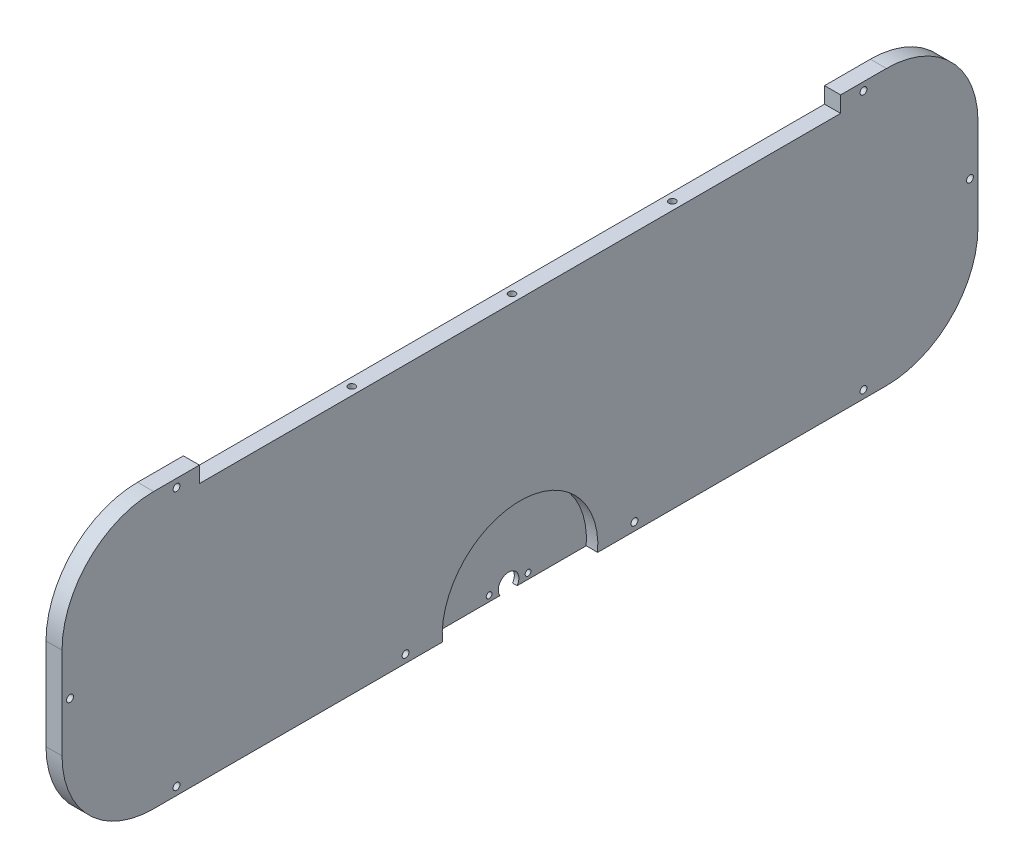
ISO-10303-21;
HEADER;
FILE_DESCRIPTION(('STEP AP214'),'2;1');
FILE_NAME('part.step','',(''),(''),'','','');
FILE_SCHEMA(('AUTOMOTIVE_DESIGN { 1 0 10303 214 1 1 1 1 }'));
ENDSEC;
DATA;
#1=APPLICATION_CONTEXT('core data for automotive mechanical design processes');
#2=APPLICATION_PROTOCOL_DEFINITION('international standard','automotive_design',2000,#1);
#3=PRODUCT_CONTEXT('',#1,'mechanical');
#4=PRODUCT('Part','Part','',(#3));
#5=PRODUCT_RELATED_PRODUCT_CATEGORY('part','',(#4));
#6=PRODUCT_DEFINITION_FORMATION('','',#4);
#7=PRODUCT_DEFINITION_CONTEXT('part definition',#1,'design');
#8=PRODUCT_DEFINITION('design','',#6,#7);
#9=PRODUCT_DEFINITION_SHAPE('','',#8);
#10=(LENGTH_UNIT() NAMED_UNIT(*) SI_UNIT(.MILLI.,.METRE.));
#11=(NAMED_UNIT(*) PLANE_ANGLE_UNIT() SI_UNIT($,.RADIAN.));
#12=(NAMED_UNIT(*) SI_UNIT($,.STERADIAN.) SOLID_ANGLE_UNIT());
#13=UNCERTAINTY_MEASURE_WITH_UNIT(LENGTH_MEASURE(1.E-05),#10,'distance_accuracy_value','');
#14=(GEOMETRIC_REPRESENTATION_CONTEXT(3) GLOBAL_UNCERTAINTY_ASSIGNED_CONTEXT((#13)) GLOBAL_UNIT_ASSIGNED_CONTEXT((#10,
#11,#12)) REPRESENTATION_CONTEXT('',''));
#15=CARTESIAN_POINT('',(0.,0.,0.));
#16=DIRECTION('',(0.,0.,1.));
#17=DIRECTION('',(1.,0.,0.));
#18=AXIS2_PLACEMENT_3D('',#15,#16,#17);
#19=CARTESIAN_POINT('',(-3.,2.49999999999994,-8.5));
#20=DIRECTION('',(1.,0.,0.));
#21=DIRECTION('',(0.,0.,-1.));
#22=AXIS2_PLACEMENT_3D('',#19,#20,#21);
#23=CYLINDRICAL_SURFACE('',#22,1.25);
#24=CARTESIAN_POINT('',(0.,2.49999999999994,-8.5));
#25=DIRECTION('',(-1.,0.,0.));
#26=DIRECTION('',(0.,0.,1.));
#27=AXIS2_PLACEMENT_3D('',#24,#25,#26);
#28=CIRCLE('',#27,1.25);
#29=CARTESIAN_POINT('',(0.,2.49999999999994,-7.25));
#30=VERTEX_POINT('',#29);
#31=EDGE_CURVE('E186',#30,#30,#28,.T.);
#32=ORIENTED_EDGE('',*,*,#31,.T.);
#33=EDGE_LOOP('',(#32));
#34=FACE_BOUND('',#33,.T.);
#35=CARTESIAN_POINT('',(2.,2.49999999999994,-8.5));
#36=DIRECTION('',(1.,0.,0.));
#37=DIRECTION('',(0.,0.,-1.));
#38=AXIS2_PLACEMENT_3D('',#35,#36,#37);
#39=CIRCLE('',#38,1.25);
#40=CARTESIAN_POINT('',(2.,2.49999999999994,-9.75));
#41=VERTEX_POINT('',#40);
#42=EDGE_CURVE('E173',#41,#41,#39,.F.);
#43=ORIENTED_EDGE('',*,*,#42,.F.);
#44=EDGE_LOOP('',(#43));
#45=FACE_BOUND('',#44,.T.);
#46=ADVANCED_FACE('F36',(#34,#45),#23,.F.);
#47=CARTESIAN_POINT('',(-3.,2.49999999999994,8.5));
#48=DIRECTION('',(1.,0.,0.));
#49=DIRECTION('',(0.,0.,-1.));
#50=AXIS2_PLACEMENT_3D('',#47,#48,#49);
#51=CYLINDRICAL_SURFACE('',#50,1.25);
#52=CARTESIAN_POINT('',(0.,2.49999999999994,8.5));
#53=DIRECTION('',(-1.,0.,0.));
#54=DIRECTION('',(0.,0.,1.));
#55=AXIS2_PLACEMENT_3D('',#52,#53,#54);
#56=CIRCLE('',#55,1.25);
#57=CARTESIAN_POINT('',(0.,2.49999999999994,9.75));
#58=VERTEX_POINT('',#57);
#59=EDGE_CURVE('E197',#58,#58,#56,.T.);
#60=ORIENTED_EDGE('',*,*,#59,.T.);
#61=EDGE_LOOP('',(#60));
#62=FACE_BOUND('',#61,.T.);
#63=CARTESIAN_POINT('',(2.,2.49999999999994,8.5));
#64=DIRECTION('',(1.,0.,0.));
#65=DIRECTION('',(0.,0.,-1.));
#66=AXIS2_PLACEMENT_3D('',#63,#64,#65);
#67=CIRCLE('',#66,1.25);
#68=CARTESIAN_POINT('',(2.,2.49999999999994,7.25));
#69=VERTEX_POINT('',#68);
#70=EDGE_CURVE('E170',#69,#69,#67,.F.);
#71=ORIENTED_EDGE('',*,*,#70,.F.);
#72=EDGE_LOOP('',(#71));
#73=FACE_BOUND('',#72,.T.);
#74=ADVANCED_FACE('F347',(#62,#73),#51,.F.);
#75=CARTESIAN_POINT('',(0.,2.49999999999994,0.));
#76=DIRECTION('',(1.,0.,0.));
#77=DIRECTION('',(0.,0.,-1.));
#78=AXIS2_PLACEMENT_3D('',#75,#76,#77);
#79=CYLINDRICAL_SURFACE('',#78,4.5);
#80=CARTESIAN_POINT('',(2.,2.49999999999994,0.));
#81=DIRECTION('',(1.,0.,0.));
#82=DIRECTION('',(0.,0.,-1.));
#83=AXIS2_PLACEMENT_3D('',#80,#81,#82);
#84=CIRCLE('',#83,4.5);
#85=CARTESIAN_POINT('',(2.,0.,3.74165738677395));
#86=VERTEX_POINT('',#85);
#87=CARTESIAN_POINT('',(2.,0.,-3.74165738677396));
#88=VERTEX_POINT('',#87);
#89=EDGE_CURVE('E11',#86,#88,#84,.F.);
#90=ORIENTED_EDGE('',*,*,#89,.F.);
#91=DIRECTION('',(1.,0.,0.));
#92=VECTOR('',#91,1.);
#93=CARTESIAN_POINT('',(0.,0.,3.74165738677395));
#94=LINE('',#93,#92);
#95=CARTESIAN_POINT('',(0.,0.,3.74165738677395));
#96=VERTEX_POINT('',#95);
#97=EDGE_CURVE('E169',#96,#86,#94,.T.);
#98=ORIENTED_EDGE('',*,*,#97,.F.);
#99=CARTESIAN_POINT('',(0.,2.49999999999994,0.));
#100=DIRECTION('',(1.,0.,0.));
#101=DIRECTION('',(0.,0.,-1.));
#102=AXIS2_PLACEMENT_3D('',#99,#100,#101);
#103=CIRCLE('',#102,4.5);
#104=CARTESIAN_POINT('',(0.,0.,-3.74165738677396));
#105=VERTEX_POINT('',#104);
#106=EDGE_CURVE('E158',#105,#96,#103,.T.);
#107=ORIENTED_EDGE('',*,*,#106,.F.);
#108=DIRECTION('',(1.,0.,0.));
#109=VECTOR('',#108,1.);
#110=CARTESIAN_POINT('',(0.,0.,-3.74165738677396));
#111=LINE('',#110,#109);
#112=EDGE_CURVE('E183',#88,#105,#111,.F.);
#113=ORIENTED_EDGE('',*,*,#112,.F.);
#114=EDGE_LOOP('',(#90,#98,#107,#113));
#115=FACE_BOUND('',#114,.T.);
#116=ADVANCED_FACE('F401',(#115),#79,.F.);
#117=CARTESIAN_POINT('',(7.,0.,-160.));
#118=DIRECTION('',(0.,1.,0.));
#119=DIRECTION('',(0.,0.,1.));
#120=AXIS2_PLACEMENT_3D('',#117,#118,#119);
#121=PLANE('',#120);
#122=DIRECTION('',(0.,0.,-1.));
#123=VECTOR('',#122,1.);
#124=CARTESIAN_POINT('',(2.,0.,-160.));
#125=LINE('',#124,#123);
#126=CARTESIAN_POINT('',(2.,0.,33.9079636663719));
#127=VERTEX_POINT('',#126);
#128=EDGE_CURVE('E50',#127,#86,#125,.T.);
#129=ORIENTED_EDGE('',*,*,#128,.F.);
#130=DIRECTION('',(1.,0.,0.));
#131=VECTOR('',#130,1.);
#132=CARTESIAN_POINT('',(2.,0.,33.9079636663719));
#133=LINE('',#132,#131);
#134=CARTESIAN_POINT('',(7.,0.,33.9079636663719));
#135=VERTEX_POINT('',#134);
#136=EDGE_CURVE('E150',#127,#135,#133,.T.);
#137=ORIENTED_EDGE('',*,*,#136,.T.);
#138=DIRECTION('',(0.,0.,-1.));
#139=VECTOR('',#138,1.);
#140=CARTESIAN_POINT('',(7.,0.,-160.));
#141=LINE('',#140,#139);
#142=CARTESIAN_POINT('',(7.,0.,160.));
#143=VERTEX_POINT('',#142);
#144=EDGE_CURVE('E279',#143,#135,#141,.T.);
#145=ORIENTED_EDGE('',*,*,#144,.F.);
#146=DIRECTION('',(-1.,0.,0.));
#147=VECTOR('',#146,1.);
#148=CARTESIAN_POINT('',(7.,0.,160.));
#149=LINE('',#148,#147);
#150=CARTESIAN_POINT('',(0.,0.,160.));
#151=VERTEX_POINT('',#150);
#152=EDGE_CURVE('E44',#143,#151,#149,.T.);
#153=ORIENTED_EDGE('',*,*,#152,.T.);
#154=DIRECTION('',(0.,0.,-1.));
#155=VECTOR('',#154,1.);
#156=CARTESIAN_POINT('',(0.,0.,-160.));
#157=LINE('',#156,#155);
#158=EDGE_CURVE('E299',#151,#96,#157,.T.);
#159=ORIENTED_EDGE('',*,*,#158,.T.);
#160=ORIENTED_EDGE('',*,*,#97,.T.);
#161=EDGE_LOOP('',(#129,#137,#145,#153,#159,#160));
#162=FACE_BOUND('',#161,.T.);
#163=ADVANCED_FACE('F167',(#162),#121,.F.);
#164=CARTESIAN_POINT('',(7.,120.,-160.));
#165=DIRECTION('',(0.,-1.,0.));
#166=DIRECTION('',(0.,0.,-1.));
#167=AXIS2_PLACEMENT_3D('',#164,#165,#166);
#168=PLANE('',#167);
#169=DIRECTION('',(0.,0.,1.));
#170=VECTOR('',#169,1.);
#171=CARTESIAN_POINT('',(0.,120.,-160.));
#172=LINE('',#171,#170);
#173=CARTESIAN_POINT('',(0.,120.,-160.));
#174=VERTEX_POINT('',#173);
#175=CARTESIAN_POINT('',(0.,120.,-140.));
#176=VERTEX_POINT('',#175);
#177=EDGE_CURVE('E308',#174,#176,#172,.T.);
#178=ORIENTED_EDGE('',*,*,#177,.T.);
#179=DIRECTION('',(1.,0.,0.));
#180=VECTOR('',#179,1.);
#181=CARTESIAN_POINT('',(0.,120.,-140.));
#182=LINE('',#181,#180);
#183=CARTESIAN_POINT('',(7.,120.,-140.));
#184=VERTEX_POINT('',#183);
#185=EDGE_CURVE('E231',#176,#184,#182,.T.);
#186=ORIENTED_EDGE('',*,*,#185,.T.);
#187=DIRECTION('',(0.,0.,1.));
#188=VECTOR('',#187,1.);
#189=CARTESIAN_POINT('',(7.,120.,-160.));
#190=LINE('',#189,#188);
#191=CARTESIAN_POINT('',(7.,120.,-160.));
#192=VERTEX_POINT('',#191);
#193=EDGE_CURVE('E288',#192,#184,#190,.T.);
#194=ORIENTED_EDGE('',*,*,#193,.F.);
#195=DIRECTION('',(-1.,0.,0.));
#196=VECTOR('',#195,1.);
#197=CARTESIAN_POINT('',(7.,120.,-160.));
#198=LINE('',#197,#196);
#199=EDGE_CURVE('E322',#192,#174,#198,.T.);
#200=ORIENTED_EDGE('',*,*,#199,.T.);
#201=EDGE_LOOP('',(#178,#186,#194,#200));
#202=FACE_BOUND('',#201,.T.);
#203=ADVANCED_FACE('F421',(#202),#168,.F.);
#204=CARTESIAN_POINT('',(7.,40.,160.));
#205=DIRECTION('',(-1.,0.,0.));
#206=DIRECTION('',(0.,0.,1.));
#207=AXIS2_PLACEMENT_3D('',#204,#205,#206);
#208=CYLINDRICAL_SURFACE('',#207,40.);
#209=CARTESIAN_POINT('',(0.,40.,160.));
#210=DIRECTION('',(1.,0.,0.));
#211=DIRECTION('',(0.,0.,1.));
#212=AXIS2_PLACEMENT_3D('',#209,#210,#211);
#213=CIRCLE('',#212,40.);
#214=CARTESIAN_POINT('',(0.,40.,200.));
#215=VERTEX_POINT('',#214);
#216=EDGE_CURVE('E273',#215,#151,#213,.T.);
#217=ORIENTED_EDGE('',*,*,#216,.T.);
#218=ORIENTED_EDGE('',*,*,#152,.F.);
#219=CARTESIAN_POINT('',(7.,40.,160.));
#220=DIRECTION('',(1.,0.,0.));
#221=DIRECTION('',(0.,0.,1.));
#222=AXIS2_PLACEMENT_3D('',#219,#220,#221);
#223=CIRCLE('',#222,40.);
#224=CARTESIAN_POINT('',(7.,40.,200.));
#225=VERTEX_POINT('',#224);
#226=EDGE_CURVE('E274',#225,#143,#223,.T.);
#227=ORIENTED_EDGE('',*,*,#226,.F.);
#228=DIRECTION('',(-1.,0.,0.));
#229=VECTOR('',#228,1.);
#230=CARTESIAN_POINT('',(7.,40.,200.));
#231=LINE('',#230,#229);
#232=EDGE_CURVE('E295',#225,#215,#231,.T.);
#233=ORIENTED_EDGE('',*,*,#232,.T.);
#234=EDGE_LOOP('',(#217,#218,#227,#233));
#235=FACE_BOUND('',#234,.T.);
#236=ADVANCED_FACE('F38',(#235),#208,.T.);
#237=CARTESIAN_POINT('',(7.,0.,-33.9079636663719));
#238=VERTEX_POINT('',#237);
#239=CARTESIAN_POINT('',(7.,0.,-160.));
#240=VERTEX_POINT('',#239);
#241=EDGE_CURVE('E277',#238,#240,#141,.T.);
#242=ORIENTED_EDGE('',*,*,#241,.F.);
#243=DIRECTION('',(1.,0.,0.));
#244=VECTOR('',#243,1.);
#245=CARTESIAN_POINT('',(2.,0.,-33.9079636663719));
#246=LINE('',#245,#244);
#247=CARTESIAN_POINT('',(2.,0.,-33.9079636663719));
#248=VERTEX_POINT('',#247);
#249=EDGE_CURVE('E159',#238,#248,#246,.F.);
#250=ORIENTED_EDGE('',*,*,#249,.T.);
#251=DIRECTION('',(0.,0.,-1.));
#252=VECTOR('',#251,1.);
#253=CARTESIAN_POINT('',(2.,0.,-160.));
#254=LINE('',#253,#252);
#255=EDGE_CURVE('E164',#88,#248,#254,.T.);
#256=ORIENTED_EDGE('',*,*,#255,.F.);
#257=ORIENTED_EDGE('',*,*,#112,.T.);
#258=CARTESIAN_POINT('',(0.,0.,-160.));
#259=VERTEX_POINT('',#258);
#260=EDGE_CURVE('E298',#105,#259,#157,.T.);
#261=ORIENTED_EDGE('',*,*,#260,.T.);
#262=DIRECTION('',(-1.,0.,0.));
#263=VECTOR('',#262,1.);
#264=CARTESIAN_POINT('',(7.,0.,-160.));
#265=LINE('',#264,#263);
#266=EDGE_CURVE('E331',#240,#259,#265,.T.);
#267=ORIENTED_EDGE('',*,*,#266,.F.);
#268=EDGE_LOOP('',(#242,#250,#256,#257,#261,#267));
#269=FACE_BOUND('',#268,.T.);
#270=ADVANCED_FACE('F403',(#269),#121,.F.);
#271=CARTESIAN_POINT('',(7.,40.,-160.));
#272=DIRECTION('',(-1.,0.,0.));
#273=DIRECTION('',(0.,0.,1.));
#274=AXIS2_PLACEMENT_3D('',#271,#272,#273);
#275=CYLINDRICAL_SURFACE('',#274,40.);
#276=CARTESIAN_POINT('',(0.,40.,-160.));
#277=DIRECTION('',(1.,0.,0.));
#278=DIRECTION('',(0.,0.,-1.));
#279=AXIS2_PLACEMENT_3D('',#276,#277,#278);
#280=CIRCLE('',#279,40.);
#281=CARTESIAN_POINT('',(0.,40.,-200.));
#282=VERTEX_POINT('',#281);
#283=EDGE_CURVE('E301',#259,#282,#280,.T.);
#284=ORIENTED_EDGE('',*,*,#283,.T.);
#285=DIRECTION('',(-1.,0.,0.));
#286=VECTOR('',#285,1.);
#287=CARTESIAN_POINT('',(7.,40.,-200.));
#288=LINE('',#287,#286);
#289=CARTESIAN_POINT('',(7.,40.,-200.));
#290=VERTEX_POINT('',#289);
#291=EDGE_CURVE('E328',#290,#282,#288,.T.);
#292=ORIENTED_EDGE('',*,*,#291,.F.);
#293=CARTESIAN_POINT('',(7.,40.,-160.));
#294=DIRECTION('',(1.,0.,0.));
#295=DIRECTION('',(0.,0.,-1.));
#296=AXIS2_PLACEMENT_3D('',#293,#294,#295);
#297=CIRCLE('',#296,40.);
#298=EDGE_CURVE('E281',#240,#290,#297,.T.);
#299=ORIENTED_EDGE('',*,*,#298,.F.);
#300=ORIENTED_EDGE('',*,*,#266,.T.);
#301=EDGE_LOOP('',(#284,#292,#299,#300));
#302=FACE_BOUND('',#301,.T.);
#303=ADVANCED_FACE('F410',(#302),#275,.T.);
#304=CARTESIAN_POINT('',(7.,40.,-200.));
#305=DIRECTION('',(0.,0.,1.));
#306=DIRECTION('',(1.,0.,0.));
#307=AXIS2_PLACEMENT_3D('',#304,#305,#306);
#308=PLANE('',#307);
#309=DIRECTION('',(0.,1.,0.));
#310=VECTOR('',#309,1.);
#311=CARTESIAN_POINT('',(0.,40.,-200.));
#312=LINE('',#311,#310);
#313=CARTESIAN_POINT('',(0.,80.,-200.));
#314=VERTEX_POINT('',#313);
#315=EDGE_CURVE('E303',#282,#314,#312,.T.);
#316=ORIENTED_EDGE('',*,*,#315,.T.);
#317=DIRECTION('',(-1.,0.,0.));
#318=VECTOR('',#317,1.);
#319=CARTESIAN_POINT('',(7.,80.,-200.));
#320=LINE('',#319,#318);
#321=CARTESIAN_POINT('',(7.,80.,-200.));
#322=VERTEX_POINT('',#321);
#323=EDGE_CURVE('E325',#322,#314,#320,.T.);
#324=ORIENTED_EDGE('',*,*,#323,.F.);
#325=DIRECTION('',(0.,1.,0.));
#326=VECTOR('',#325,1.);
#327=CARTESIAN_POINT('',(7.,40.,-200.));
#328=LINE('',#327,#326);
#329=EDGE_CURVE('E283',#290,#322,#328,.T.);
#330=ORIENTED_EDGE('',*,*,#329,.F.);
#331=ORIENTED_EDGE('',*,*,#291,.T.);
#332=EDGE_LOOP('',(#316,#324,#330,#331));
#333=FACE_BOUND('',#332,.T.);
#334=ADVANCED_FACE('F413',(#333),#308,.F.);
#335=CARTESIAN_POINT('',(7.,80.,-160.));
#336=DIRECTION('',(-1.,0.,0.));
#337=DIRECTION('',(0.,0.,1.));
#338=AXIS2_PLACEMENT_3D('',#335,#336,#337);
#339=CYLINDRICAL_SURFACE('',#338,40.);
#340=CARTESIAN_POINT('',(0.,80.,-160.));
#341=DIRECTION('',(1.,0.,0.));
#342=DIRECTION('',(0.,0.,1.));
#343=AXIS2_PLACEMENT_3D('',#340,#341,#342);
#344=CIRCLE('',#343,40.);
#345=EDGE_CURVE('E305',#314,#174,#344,.T.);
#346=ORIENTED_EDGE('',*,*,#345,.T.);
#347=ORIENTED_EDGE('',*,*,#199,.F.);
#348=CARTESIAN_POINT('',(7.,80.,-160.));
#349=DIRECTION('',(1.,0.,0.));
#350=DIRECTION('',(0.,0.,1.));
#351=AXIS2_PLACEMENT_3D('',#348,#349,#350);
#352=CIRCLE('',#351,40.);
#353=EDGE_CURVE('E285',#322,#192,#352,.T.);
#354=ORIENTED_EDGE('',*,*,#353,.F.);
#355=ORIENTED_EDGE('',*,*,#323,.T.);
#356=EDGE_LOOP('',(#346,#347,#354,#355));
#357=FACE_BOUND('',#356,.T.);
#358=ADVANCED_FACE('F418',(#357),#339,.T.);
#359=CARTESIAN_POINT('',(7.,120.,140.));
#360=VERTEX_POINT('',#359);
#361=CARTESIAN_POINT('',(7.,120.,160.));
#362=VERTEX_POINT('',#361);
#363=EDGE_CURVE('E287',#360,#362,#190,.T.);
#364=ORIENTED_EDGE('',*,*,#363,.F.);
#365=DIRECTION('',(1.,0.,0.));
#366=VECTOR('',#365,1.);
#367=CARTESIAN_POINT('',(0.,120.,140.));
#368=LINE('',#367,#366);
#369=CARTESIAN_POINT('',(0.,120.,140.));
#370=VERTEX_POINT('',#369);
#371=EDGE_CURVE('E230',#370,#360,#368,.T.);
#372=ORIENTED_EDGE('',*,*,#371,.F.);
#373=CARTESIAN_POINT('',(0.,120.,160.));
#374=VERTEX_POINT('',#373);
#375=EDGE_CURVE('E307',#370,#374,#172,.T.);
#376=ORIENTED_EDGE('',*,*,#375,.T.);
#377=DIRECTION('',(-1.,0.,0.));
#378=VECTOR('',#377,1.);
#379=CARTESIAN_POINT('',(7.,120.,160.));
#380=LINE('',#379,#378);
#381=EDGE_CURVE('E319',#362,#374,#380,.T.);
#382=ORIENTED_EDGE('',*,*,#381,.F.);
#383=EDGE_LOOP('',(#364,#372,#376,#382));
#384=FACE_BOUND('',#383,.T.);
#385=ADVANCED_FACE('F430',(#384),#168,.F.);
#386=CARTESIAN_POINT('',(7.,80.,160.));
#387=DIRECTION('',(-1.,0.,0.));
#388=DIRECTION('',(0.,0.,1.));
#389=AXIS2_PLACEMENT_3D('',#386,#387,#388);
#390=CYLINDRICAL_SURFACE('',#389,40.);
#391=CARTESIAN_POINT('',(0.,80.,160.));
#392=DIRECTION('',(1.,0.,0.));
#393=DIRECTION('',(0.,0.,-1.));
#394=AXIS2_PLACEMENT_3D('',#391,#392,#393);
#395=CIRCLE('',#394,40.);
#396=CARTESIAN_POINT('',(0.,80.,200.));
#397=VERTEX_POINT('',#396);
#398=EDGE_CURVE('E311',#374,#397,#395,.T.);
#399=ORIENTED_EDGE('',*,*,#398,.T.);
#400=DIRECTION('',(-1.,0.,0.));
#401=VECTOR('',#400,1.);
#402=CARTESIAN_POINT('',(7.,80.,200.));
#403=LINE('',#402,#401);
#404=CARTESIAN_POINT('',(7.,80.,200.));
#405=VERTEX_POINT('',#404);
#406=EDGE_CURVE('E316',#405,#397,#403,.T.);
#407=ORIENTED_EDGE('',*,*,#406,.F.);
#408=CARTESIAN_POINT('',(7.,80.,160.));
#409=DIRECTION('',(1.,0.,0.));
#410=DIRECTION('',(0.,0.,-1.));
#411=AXIS2_PLACEMENT_3D('',#408,#409,#410);
#412=CIRCLE('',#411,40.);
#413=EDGE_CURVE('E291',#362,#405,#412,.T.);
#414=ORIENTED_EDGE('',*,*,#413,.F.);
#415=ORIENTED_EDGE('',*,*,#381,.T.);
#416=EDGE_LOOP('',(#399,#407,#414,#415));
#417=FACE_BOUND('',#416,.T.);
#418=ADVANCED_FACE('F755',(#417),#390,.T.);
#419=CARTESIAN_POINT('',(7.,40.,200.));
#420=DIRECTION('',(0.,0.,-1.));
#421=DIRECTION('',(-1.,0.,0.));
#422=AXIS2_PLACEMENT_3D('',#419,#420,#421);
#423=PLANE('',#422);
#424=DIRECTION('',(0.,-1.,0.));
#425=VECTOR('',#424,1.);
#426=CARTESIAN_POINT('',(0.,40.,200.));
#427=LINE('',#426,#425);
#428=EDGE_CURVE('E278',#397,#215,#427,.T.);
#429=ORIENTED_EDGE('',*,*,#428,.T.);
#430=ORIENTED_EDGE('',*,*,#232,.F.);
#431=DIRECTION('',(0.,-1.,0.));
#432=VECTOR('',#431,1.);
#433=CARTESIAN_POINT('',(7.,40.,200.));
#434=LINE('',#433,#432);
#435=EDGE_CURVE('E293',#405,#225,#434,.T.);
#436=ORIENTED_EDGE('',*,*,#435,.F.);
#437=ORIENTED_EDGE('',*,*,#406,.T.);
#438=EDGE_LOOP('',(#429,#430,#436,#437));
#439=FACE_BOUND('',#438,.T.);
#440=ADVANCED_FACE('F385',(#439),#423,.F.);
#441=CARTESIAN_POINT('',(7.,40.,160.));
#442=DIRECTION('',(-1.,0.,0.));
#443=DIRECTION('',(0.,0.,1.));
#444=AXIS2_PLACEMENT_3D('',#441,#442,#443);
#445=PLANE('',#444);
#446=CARTESIAN_POINT('',(7.,116.5,-150.));
#447=DIRECTION('',(-1.,0.,0.));
#448=DIRECTION('',(0.,0.,1.));
#449=AXIS2_PLACEMENT_3D('',#446,#447,#448);
#450=CIRCLE('',#449,1.5);
#451=CARTESIAN_POINT('',(7.,116.5,-148.5));
#452=VERTEX_POINT('',#451);
#453=EDGE_CURVE('E270',#452,#452,#450,.T.);
#454=ORIENTED_EDGE('',*,*,#453,.T.);
#455=EDGE_LOOP('',(#454));
#456=FACE_BOUND('',#455,.T.);
#457=CARTESIAN_POINT('',(7.,60.0000000000001,-196.5));
#458=DIRECTION('',(-1.,0.,0.));
#459=DIRECTION('',(0.,0.,1.));
#460=AXIS2_PLACEMENT_3D('',#457,#458,#459);
#461=CIRCLE('',#460,1.5);
#462=CARTESIAN_POINT('',(7.,60.0000000000001,-195.));
#463=VERTEX_POINT('',#462);
#464=EDGE_CURVE('E267',#463,#463,#461,.T.);
#465=ORIENTED_EDGE('',*,*,#464,.T.);
#466=EDGE_LOOP('',(#465));
#467=FACE_BOUND('',#466,.T.);
#468=CARTESIAN_POINT('',(7.,3.5,-150.));
#469=DIRECTION('',(-1.,0.,0.));
#470=DIRECTION('',(0.,0.,1.));
#471=AXIS2_PLACEMENT_3D('',#468,#469,#470);
#472=CIRCLE('',#471,1.5);
#473=CARTESIAN_POINT('',(7.,3.5,-148.5));
#474=VERTEX_POINT('',#473);
#475=EDGE_CURVE('E264',#474,#474,#472,.T.);
#476=ORIENTED_EDGE('',*,*,#475,.T.);
#477=EDGE_LOOP('',(#476));
#478=FACE_BOUND('',#477,.T.);
#479=CARTESIAN_POINT('',(7.,3.49999999999997,-50.));
#480=DIRECTION('',(-1.,0.,0.));
#481=DIRECTION('',(0.,0.,1.));
#482=AXIS2_PLACEMENT_3D('',#479,#480,#481);
#483=CIRCLE('',#482,1.5);
#484=CARTESIAN_POINT('',(7.,3.49999999999997,-48.5));
#485=VERTEX_POINT('',#484);
#486=EDGE_CURVE('E261',#485,#485,#483,.T.);
#487=ORIENTED_EDGE('',*,*,#486,.T.);
#488=EDGE_LOOP('',(#487));
#489=FACE_BOUND('',#488,.T.);
#490=CARTESIAN_POINT('',(7.,3.49999999999994,150.));
#491=DIRECTION('',(-1.,0.,0.));
#492=DIRECTION('',(0.,0.,1.));
#493=AXIS2_PLACEMENT_3D('',#490,#491,#492);
#494=CIRCLE('',#493,1.5);
#495=CARTESIAN_POINT('',(7.,3.49999999999994,151.5));
#496=VERTEX_POINT('',#495);
#497=EDGE_CURVE('E258',#496,#496,#494,.T.);
#498=ORIENTED_EDGE('',*,*,#497,.T.);
#499=EDGE_LOOP('',(#498));
#500=FACE_BOUND('',#499,.T.);
#501=CARTESIAN_POINT('',(7.,3.49999999999994,50.));
#502=DIRECTION('',(-1.,0.,0.));
#503=DIRECTION('',(0.,0.,1.));
#504=AXIS2_PLACEMENT_3D('',#501,#502,#503);
#505=CIRCLE('',#504,1.5);
#506=CARTESIAN_POINT('',(7.,3.49999999999994,51.5));
#507=VERTEX_POINT('',#506);
#508=EDGE_CURVE('E255',#507,#507,#505,.T.);
#509=ORIENTED_EDGE('',*,*,#508,.T.);
#510=EDGE_LOOP('',(#509));
#511=FACE_BOUND('',#510,.T.);
#512=CARTESIAN_POINT('',(7.,60.,196.5));
#513=DIRECTION('',(-1.,0.,0.));
#514=DIRECTION('',(0.,0.,1.));
#515=AXIS2_PLACEMENT_3D('',#512,#513,#514);
#516=CIRCLE('',#515,1.5);
#517=CARTESIAN_POINT('',(7.,60.,198.));
#518=VERTEX_POINT('',#517);
#519=EDGE_CURVE('E252',#518,#518,#516,.T.);
#520=ORIENTED_EDGE('',*,*,#519,.T.);
#521=EDGE_LOOP('',(#520));
#522=FACE_BOUND('',#521,.T.);
#523=CARTESIAN_POINT('',(7.,116.5,150.));
#524=DIRECTION('',(-1.,0.,0.));
#525=DIRECTION('',(0.,0.,1.));
#526=AXIS2_PLACEMENT_3D('',#523,#524,#525);
#527=CIRCLE('',#526,1.5);
#528=CARTESIAN_POINT('',(7.,116.5,151.5));
#529=VERTEX_POINT('',#528);
#530=EDGE_CURVE('E249',#529,#529,#527,.T.);
#531=ORIENTED_EDGE('',*,*,#530,.T.);
#532=EDGE_LOOP('',(#531));
#533=FACE_BOUND('',#532,.T.);
#534=ORIENTED_EDGE('',*,*,#144,.T.);
#535=CARTESIAN_POINT('',(7.,2.49999999999994,0.));
#536=DIRECTION('',(1.,0.,0.));
#537=DIRECTION('',(0.,0.,-1.));
#538=AXIS2_PLACEMENT_3D('',#535,#536,#537);
#539=CIRCLE('',#538,34.);
#540=EDGE_CURVE('E155',#238,#135,#539,.T.);
#541=ORIENTED_EDGE('',*,*,#540,.F.);
#542=ORIENTED_EDGE('',*,*,#241,.T.);
#543=ORIENTED_EDGE('',*,*,#298,.T.);
#544=ORIENTED_EDGE('',*,*,#329,.T.);
#545=ORIENTED_EDGE('',*,*,#353,.T.);
#546=ORIENTED_EDGE('',*,*,#193,.T.);
#547=DIRECTION('',(0.,-1.,0.));
#548=VECTOR('',#547,1.);
#549=CARTESIAN_POINT('',(7.,40.,-140.));
#550=LINE('',#549,#548);
#551=CARTESIAN_POINT('',(7.,113.,-140.));
#552=VERTEX_POINT('',#551);
#553=EDGE_CURVE('E246',#184,#552,#550,.T.);
#554=ORIENTED_EDGE('',*,*,#553,.T.);
#555=DIRECTION('',(0.,0.,1.));
#556=VECTOR('',#555,1.);
#557=CARTESIAN_POINT('',(7.,113.,160.));
#558=LINE('',#557,#556);
#559=CARTESIAN_POINT('',(7.,113.,140.));
#560=VERTEX_POINT('',#559);
#561=EDGE_CURVE('E243',#552,#560,#558,.T.);
#562=ORIENTED_EDGE('',*,*,#561,.T.);
#563=DIRECTION('',(0.,1.,0.));
#564=VECTOR('',#563,1.);
#565=CARTESIAN_POINT('',(7.,40.,140.));
#566=LINE('',#565,#564);
#567=EDGE_CURVE('E234',#560,#360,#566,.T.);
#568=ORIENTED_EDGE('',*,*,#567,.T.);
#569=ORIENTED_EDGE('',*,*,#363,.T.);
#570=ORIENTED_EDGE('',*,*,#413,.T.);
#571=ORIENTED_EDGE('',*,*,#435,.T.);
#572=ORIENTED_EDGE('',*,*,#226,.T.);
#573=EDGE_LOOP('',(#534,#541,#542,#543,#544,#545,#546,#554,#562,#568,#569,#570,#571,#572));
#574=FACE_BOUND('',#573,.T.);
#575=ADVANCED_FACE('F354',(#456,#467,#478,#489,#500,#511,#522,#533,#574),#445,.F.);
#576=CARTESIAN_POINT('',(0.,40.,160.));
#577=DIRECTION('',(-1.,0.,0.));
#578=DIRECTION('',(0.,0.,1.));
#579=AXIS2_PLACEMENT_3D('',#576,#577,#578);
#580=PLANE('',#579);
#581=ORIENTED_EDGE('',*,*,#106,.T.);
#582=ORIENTED_EDGE('',*,*,#158,.F.);
#583=ORIENTED_EDGE('',*,*,#216,.F.);
#584=ORIENTED_EDGE('',*,*,#428,.F.);
#585=ORIENTED_EDGE('',*,*,#398,.F.);
#586=ORIENTED_EDGE('',*,*,#375,.F.);
#587=DIRECTION('',(0.,-1.,0.));
#588=VECTOR('',#587,1.);
#589=CARTESIAN_POINT('',(0.,120.,140.));
#590=LINE('',#589,#588);
#591=CARTESIAN_POINT('',(0.,113.,140.));
#592=VERTEX_POINT('',#591);
#593=EDGE_CURVE('E201',#370,#592,#590,.T.);
#594=ORIENTED_EDGE('',*,*,#593,.T.);
#595=DIRECTION('',(0.,0.,-1.));
#596=VECTOR('',#595,1.);
#597=CARTESIAN_POINT('',(0.,113.,140.));
#598=LINE('',#597,#596);
#599=CARTESIAN_POINT('',(0.,113.,-140.));
#600=VERTEX_POINT('',#599);
#601=EDGE_CURVE('E58',#592,#600,#598,.T.);
#602=ORIENTED_EDGE('',*,*,#601,.T.);
#603=DIRECTION('',(0.,1.,0.));
#604=VECTOR('',#603,1.);
#605=CARTESIAN_POINT('',(0.,113.,-140.));
#606=LINE('',#605,#604);
#607=EDGE_CURVE('E227',#600,#176,#606,.T.);
#608=ORIENTED_EDGE('',*,*,#607,.T.);
#609=ORIENTED_EDGE('',*,*,#177,.F.);
#610=ORIENTED_EDGE('',*,*,#345,.F.);
#611=ORIENTED_EDGE('',*,*,#315,.F.);
#612=ORIENTED_EDGE('',*,*,#283,.F.);
#613=ORIENTED_EDGE('',*,*,#260,.F.);
#614=EDGE_LOOP('',(#581,#582,#583,#584,#585,#586,#594,#602,#608,#609,#610,#611,#612,#613));
#615=FACE_BOUND('',#614,.T.);
#616=ORIENTED_EDGE('',*,*,#59,.F.);
#617=EDGE_LOOP('',(#616));
#618=FACE_BOUND('',#617,.T.);
#619=ORIENTED_EDGE('',*,*,#31,.F.);
#620=EDGE_LOOP('',(#619));
#621=FACE_BOUND('',#620,.T.);
#622=CARTESIAN_POINT('',(0.,116.5,-150.));
#623=DIRECTION('',(1.,0.,0.));
#624=DIRECTION('',(0.,0.,1.));
#625=AXIS2_PLACEMENT_3D('',#622,#623,#624);
#626=CIRCLE('',#625,1.5);
#627=CARTESIAN_POINT('',(0.,116.5,-148.5));
#628=VERTEX_POINT('',#627);
#629=EDGE_CURVE('E220',#628,#628,#626,.T.);
#630=ORIENTED_EDGE('',*,*,#629,.T.);
#631=EDGE_LOOP('',(#630));
#632=FACE_BOUND('',#631,.T.);
#633=CARTESIAN_POINT('',(0.,60.0000000000001,-196.5));
#634=DIRECTION('',(1.,0.,0.));
#635=DIRECTION('',(0.,0.,1.));
#636=AXIS2_PLACEMENT_3D('',#633,#634,#635);
#637=CIRCLE('',#636,1.5);
#638=CARTESIAN_POINT('',(0.,60.0000000000001,-195.));
#639=VERTEX_POINT('',#638);
#640=EDGE_CURVE('E217',#639,#639,#637,.T.);
#641=ORIENTED_EDGE('',*,*,#640,.T.);
#642=EDGE_LOOP('',(#641));
#643=FACE_BOUND('',#642,.T.);
#644=CARTESIAN_POINT('',(0.,3.5,-150.));
#645=DIRECTION('',(1.,0.,0.));
#646=DIRECTION('',(0.,0.,1.));
#647=AXIS2_PLACEMENT_3D('',#644,#645,#646);
#648=CIRCLE('',#647,1.5);
#649=CARTESIAN_POINT('',(0.,3.5,-148.5));
#650=VERTEX_POINT('',#649);
#651=EDGE_CURVE('E214',#650,#650,#648,.T.);
#652=ORIENTED_EDGE('',*,*,#651,.T.);
#653=EDGE_LOOP('',(#652));
#654=FACE_BOUND('',#653,.T.);
#655=CARTESIAN_POINT('',(0.,3.49999999999997,-50.));
#656=DIRECTION('',(1.,0.,0.));
#657=DIRECTION('',(0.,0.,1.));
#658=AXIS2_PLACEMENT_3D('',#655,#656,#657);
#659=CIRCLE('',#658,1.5);
#660=CARTESIAN_POINT('',(0.,3.49999999999997,-48.5));
#661=VERTEX_POINT('',#660);
#662=EDGE_CURVE('E211',#661,#661,#659,.T.);
#663=ORIENTED_EDGE('',*,*,#662,.T.);
#664=EDGE_LOOP('',(#663));
#665=FACE_BOUND('',#664,.T.);
#666=CARTESIAN_POINT('',(0.,3.49999999999994,150.));
#667=DIRECTION('',(1.,0.,0.));
#668=DIRECTION('',(0.,0.,-1.));
#669=AXIS2_PLACEMENT_3D('',#666,#667,#668);
#670=CIRCLE('',#669,1.5);
#671=CARTESIAN_POINT('',(0.,3.49999999999994,148.5));
#672=VERTEX_POINT('',#671);
#673=EDGE_CURVE('E208',#672,#672,#670,.T.);
#674=ORIENTED_EDGE('',*,*,#673,.T.);
#675=EDGE_LOOP('',(#674));
#676=FACE_BOUND('',#675,.T.);
#677=CARTESIAN_POINT('',(0.,3.49999999999994,50.));
#678=DIRECTION('',(1.,0.,0.));
#679=DIRECTION('',(0.,0.,-1.));
#680=AXIS2_PLACEMENT_3D('',#677,#678,#679);
#681=CIRCLE('',#680,1.5);
#682=CARTESIAN_POINT('',(0.,3.49999999999994,48.5));
#683=VERTEX_POINT('',#682);
#684=EDGE_CURVE('E205',#683,#683,#681,.T.);
#685=ORIENTED_EDGE('',*,*,#684,.T.);
#686=EDGE_LOOP('',(#685));
#687=FACE_BOUND('',#686,.T.);
#688=CARTESIAN_POINT('',(0.,60.,196.5));
#689=DIRECTION('',(1.,0.,0.));
#690=DIRECTION('',(0.,0.,-1.));
#691=AXIS2_PLACEMENT_3D('',#688,#689,#690);
#692=CIRCLE('',#691,1.5);
#693=CARTESIAN_POINT('',(0.,60.,195.));
#694=VERTEX_POINT('',#693);
#695=EDGE_CURVE('E202',#694,#694,#692,.T.);
#696=ORIENTED_EDGE('',*,*,#695,.T.);
#697=EDGE_LOOP('',(#696));
#698=FACE_BOUND('',#697,.T.);
#699=CARTESIAN_POINT('',(0.,116.5,150.));
#700=DIRECTION('',(1.,0.,0.));
#701=DIRECTION('',(0.,0.,-1.));
#702=AXIS2_PLACEMENT_3D('',#699,#700,#701);
#703=CIRCLE('',#702,1.5);
#704=CARTESIAN_POINT('',(0.,116.5,148.5));
#705=VERTEX_POINT('',#704);
#706=EDGE_CURVE('E198',#705,#705,#703,.T.);
#707=ORIENTED_EDGE('',*,*,#706,.T.);
#708=EDGE_LOOP('',(#707));
#709=FACE_BOUND('',#708,.T.);
#710=ADVANCED_FACE('F350',(#615,#618,#621,#632,#643,#654,#665,#676,#687,#698,#709),#580,.T.);
#711=CARTESIAN_POINT('',(0.,113.,-140.));
#712=DIRECTION('',(0.,0.,-1.));
#713=DIRECTION('',(-1.,0.,0.));
#714=AXIS2_PLACEMENT_3D('',#711,#712,#713);
#715=PLANE('',#714);
#716=ORIENTED_EDGE('',*,*,#185,.F.);
#717=ORIENTED_EDGE('',*,*,#607,.F.);
#718=DIRECTION('',(1.,0.,0.));
#719=VECTOR('',#718,1.);
#720=CARTESIAN_POINT('',(0.,113.,-140.));
#721=LINE('',#720,#719);
#722=EDGE_CURVE('E235',#600,#552,#721,.T.);
#723=ORIENTED_EDGE('',*,*,#722,.T.);
#724=ORIENTED_EDGE('',*,*,#553,.F.);
#725=EDGE_LOOP('',(#716,#717,#723,#724));
#726=FACE_BOUND('',#725,.T.);
#727=ADVANCED_FACE('F353',(#726),#715,.F.);
#728=CARTESIAN_POINT('',(0.,113.,140.));
#729=DIRECTION('',(0.,-1.,0.));
#730=DIRECTION('',(0.,0.,-1.));
#731=AXIS2_PLACEMENT_3D('',#728,#729,#730);
#732=PLANE('',#731);
#733=CARTESIAN_POINT('',(3.5,113.,-70.));
#734=DIRECTION('',(0.,-1.,0.));
#735=DIRECTION('',(0.,0.,-1.));
#736=AXIS2_PLACEMENT_3D('',#733,#734,#735);
#737=CIRCLE('',#736,1.5);
#738=CARTESIAN_POINT('',(3.5,113.,-71.5));
#739=VERTEX_POINT('',#738);
#740=EDGE_CURVE('E223',#739,#739,#737,.F.);
#741=ORIENTED_EDGE('',*,*,#740,.F.);
#742=EDGE_LOOP('',(#741));
#743=FACE_BOUND('',#742,.T.);
#744=CARTESIAN_POINT('',(3.5,113.,0.));
#745=DIRECTION('',(0.,-1.,0.));
#746=DIRECTION('',(0.,0.,-1.));
#747=AXIS2_PLACEMENT_3D('',#744,#745,#746);
#748=CIRCLE('',#747,1.5);
#749=CARTESIAN_POINT('',(3.5,113.,-1.5));
#750=VERTEX_POINT('',#749);
#751=EDGE_CURVE('E338',#750,#750,#748,.F.);
#752=ORIENTED_EDGE('',*,*,#751,.F.);
#753=EDGE_LOOP('',(#752));
#754=FACE_BOUND('',#753,.T.);
#755=CARTESIAN_POINT('',(3.5,113.,70.));
#756=DIRECTION('',(0.,-1.,0.));
#757=DIRECTION('',(0.,0.,-1.));
#758=AXIS2_PLACEMENT_3D('',#755,#756,#757);
#759=CIRCLE('',#758,1.5);
#760=CARTESIAN_POINT('',(3.5,113.,68.5));
#761=VERTEX_POINT('',#760);
#762=EDGE_CURVE('E190',#761,#761,#759,.F.);
#763=ORIENTED_EDGE('',*,*,#762,.F.);
#764=EDGE_LOOP('',(#763));
#765=FACE_BOUND('',#764,.T.);
#766=ORIENTED_EDGE('',*,*,#722,.F.);
#767=ORIENTED_EDGE('',*,*,#601,.F.);
#768=DIRECTION('',(1.,0.,0.));
#769=VECTOR('',#768,1.);
#770=CARTESIAN_POINT('',(0.,113.,140.));
#771=LINE('',#770,#769);
#772=EDGE_CURVE('E238',#592,#560,#771,.T.);
#773=ORIENTED_EDGE('',*,*,#772,.T.);
#774=ORIENTED_EDGE('',*,*,#561,.F.);
#775=EDGE_LOOP('',(#766,#767,#773,#774));
#776=FACE_BOUND('',#775,.T.);
#777=ADVANCED_FACE('F434',(#743,#754,#765,#776),#732,.F.);
#778=CARTESIAN_POINT('',(0.,120.,140.));
#779=DIRECTION('',(0.,0.,1.));
#780=DIRECTION('',(0.,-1.,0.));
#781=AXIS2_PLACEMENT_3D('',#778,#779,#780);
#782=PLANE('',#781);
#783=ORIENTED_EDGE('',*,*,#772,.F.);
#784=ORIENTED_EDGE('',*,*,#593,.F.);
#785=ORIENTED_EDGE('',*,*,#371,.T.);
#786=ORIENTED_EDGE('',*,*,#567,.F.);
#787=EDGE_LOOP('',(#783,#784,#785,#786));
#788=FACE_BOUND('',#787,.T.);
#789=ADVANCED_FACE('F379',(#788),#782,.F.);
#790=CARTESIAN_POINT('',(0.,116.5,150.));
#791=DIRECTION('',(1.,0.,0.));
#792=DIRECTION('',(0.,0.,-1.));
#793=AXIS2_PLACEMENT_3D('',#790,#791,#792);
#794=CYLINDRICAL_SURFACE('',#793,1.5);
#795=ORIENTED_EDGE('',*,*,#706,.F.);
#796=EDGE_LOOP('',(#795));
#797=FACE_BOUND('',#796,.T.);
#798=ORIENTED_EDGE('',*,*,#530,.F.);
#799=EDGE_LOOP('',(#798));
#800=FACE_BOUND('',#799,.T.);
#801=ADVANCED_FACE('F375',(#797,#800),#794,.F.);
#802=CARTESIAN_POINT('',(0.,60.,196.5));
#803=DIRECTION('',(1.,0.,0.));
#804=DIRECTION('',(0.,0.,-1.));
#805=AXIS2_PLACEMENT_3D('',#802,#803,#804);
#806=CYLINDRICAL_SURFACE('',#805,1.5);
#807=ORIENTED_EDGE('',*,*,#695,.F.);
#808=EDGE_LOOP('',(#807));
#809=FACE_BOUND('',#808,.T.);
#810=ORIENTED_EDGE('',*,*,#519,.F.);
#811=EDGE_LOOP('',(#810));
#812=FACE_BOUND('',#811,.T.);
#813=ADVANCED_FACE('F378',(#809,#812),#806,.F.);
#814=CARTESIAN_POINT('',(0.,3.49999999999994,50.));
#815=DIRECTION('',(1.,0.,0.));
#816=DIRECTION('',(0.,0.,-1.));
#817=AXIS2_PLACEMENT_3D('',#814,#815,#816);
#818=CYLINDRICAL_SURFACE('',#817,1.5);
#819=ORIENTED_EDGE('',*,*,#684,.F.);
#820=EDGE_LOOP('',(#819));
#821=FACE_BOUND('',#820,.T.);
#822=ORIENTED_EDGE('',*,*,#508,.F.);
#823=EDGE_LOOP('',(#822));
#824=FACE_BOUND('',#823,.T.);
#825=ADVANCED_FACE('F484',(#821,#824),#818,.F.);
#826=CARTESIAN_POINT('',(0.,3.49999999999994,150.));
#827=DIRECTION('',(1.,0.,0.));
#828=DIRECTION('',(0.,0.,-1.));
#829=AXIS2_PLACEMENT_3D('',#826,#827,#828);
#830=CYLINDRICAL_SURFACE('',#829,1.5);
#831=ORIENTED_EDGE('',*,*,#673,.F.);
#832=EDGE_LOOP('',(#831));
#833=FACE_BOUND('',#832,.T.);
#834=ORIENTED_EDGE('',*,*,#497,.F.);
#835=EDGE_LOOP('',(#834));
#836=FACE_BOUND('',#835,.T.);
#837=ADVANCED_FACE('F488',(#833,#836),#830,.F.);
#838=CARTESIAN_POINT('',(0.,3.49999999999997,-50.));
#839=DIRECTION('',(1.,0.,0.));
#840=DIRECTION('',(0.,0.,-1.));
#841=AXIS2_PLACEMENT_3D('',#838,#839,#840);
#842=CYLINDRICAL_SURFACE('',#841,1.5);
#843=ORIENTED_EDGE('',*,*,#662,.F.);
#844=EDGE_LOOP('',(#843));
#845=FACE_BOUND('',#844,.T.);
#846=ORIENTED_EDGE('',*,*,#486,.F.);
#847=EDGE_LOOP('',(#846));
#848=FACE_BOUND('',#847,.T.);
#849=ADVANCED_FACE('F492',(#845,#848),#842,.F.);
#850=CARTESIAN_POINT('',(0.,3.5,-150.));
#851=DIRECTION('',(1.,0.,0.));
#852=DIRECTION('',(0.,0.,-1.));
#853=AXIS2_PLACEMENT_3D('',#850,#851,#852);
#854=CYLINDRICAL_SURFACE('',#853,1.5);
#855=ORIENTED_EDGE('',*,*,#651,.F.);
#856=EDGE_LOOP('',(#855));
#857=FACE_BOUND('',#856,.T.);
#858=ORIENTED_EDGE('',*,*,#475,.F.);
#859=EDGE_LOOP('',(#858));
#860=FACE_BOUND('',#859,.T.);
#861=ADVANCED_FACE('F496',(#857,#860),#854,.F.);
#862=CARTESIAN_POINT('',(0.,60.0000000000001,-196.5));
#863=DIRECTION('',(1.,0.,0.));
#864=DIRECTION('',(0.,0.,-1.));
#865=AXIS2_PLACEMENT_3D('',#862,#863,#864);
#866=CYLINDRICAL_SURFACE('',#865,1.5);
#867=ORIENTED_EDGE('',*,*,#640,.F.);
#868=EDGE_LOOP('',(#867));
#869=FACE_BOUND('',#868,.T.);
#870=ORIENTED_EDGE('',*,*,#464,.F.);
#871=EDGE_LOOP('',(#870));
#872=FACE_BOUND('',#871,.T.);
#873=ADVANCED_FACE('F500',(#869,#872),#866,.F.);
#874=CARTESIAN_POINT('',(0.,116.5,-150.));
#875=DIRECTION('',(1.,0.,0.));
#876=DIRECTION('',(0.,0.,-1.));
#877=AXIS2_PLACEMENT_3D('',#874,#875,#876);
#878=CYLINDRICAL_SURFACE('',#877,1.5);
#879=ORIENTED_EDGE('',*,*,#629,.F.);
#880=EDGE_LOOP('',(#879));
#881=FACE_BOUND('',#880,.T.);
#882=ORIENTED_EDGE('',*,*,#453,.F.);
#883=EDGE_LOOP('',(#882));
#884=FACE_BOUND('',#883,.T.);
#885=ADVANCED_FACE('F477',(#881,#884),#878,.F.);
#886=CARTESIAN_POINT('',(3.5,120.,70.));
#887=DIRECTION('',(0.,-1.,0.));
#888=DIRECTION('',(0.,0.,-1.));
#889=AXIS2_PLACEMENT_3D('',#886,#887,#888);
#890=CYLINDRICAL_SURFACE('',#889,1.5);
#891=CARTESIAN_POINT('',(3.5,106.,70.));
#892=DIRECTION('',(0.,1.,0.));
#893=DIRECTION('',(0.,0.,1.));
#894=AXIS2_PLACEMENT_3D('',#891,#892,#893);
#895=CIRCLE('',#894,1.5);
#896=CARTESIAN_POINT('',(3.5,106.,71.5));
#897=VERTEX_POINT('',#896);
#898=EDGE_CURVE('E194',#897,#897,#895,.T.);
#899=ORIENTED_EDGE('',*,*,#898,.F.);
#900=EDGE_LOOP('',(#899));
#901=FACE_BOUND('',#900,.T.);
#902=ORIENTED_EDGE('',*,*,#762,.T.);
#903=EDGE_LOOP('',(#902));
#904=FACE_BOUND('',#903,.T.);
#905=ADVANCED_FACE('F474',(#901,#904),#890,.F.);
#906=CARTESIAN_POINT('',(3.5,106.,70.));
#907=DIRECTION('',(0.,1.,0.));
#908=DIRECTION('',(0.,0.,1.));
#909=AXIS2_PLACEMENT_3D('',#906,#907,#908);
#910=PLANE('',#909);
#911=ORIENTED_EDGE('',*,*,#898,.T.);
#912=EDGE_LOOP('',(#911));
#913=FACE_BOUND('',#912,.T.);
#914=ADVANCED_FACE('F469',(#913),#910,.T.);
#915=CARTESIAN_POINT('',(3.5,120.,0.));
#916=DIRECTION('',(0.,-1.,0.));
#917=DIRECTION('',(0.,0.,-1.));
#918=AXIS2_PLACEMENT_3D('',#915,#916,#917);
#919=CYLINDRICAL_SURFACE('',#918,1.5);
#920=CARTESIAN_POINT('',(3.5,106.,0.));
#921=DIRECTION('',(0.,1.,0.));
#922=DIRECTION('',(0.,0.,1.));
#923=AXIS2_PLACEMENT_3D('',#920,#921,#922);
#924=CIRCLE('',#923,1.5);
#925=CARTESIAN_POINT('',(3.5,106.,1.5));
#926=VERTEX_POINT('',#925);
#927=EDGE_CURVE('E191',#926,#926,#924,.T.);
#928=ORIENTED_EDGE('',*,*,#927,.F.);
#929=EDGE_LOOP('',(#928));
#930=FACE_BOUND('',#929,.T.);
#931=ORIENTED_EDGE('',*,*,#751,.T.);
#932=EDGE_LOOP('',(#931));
#933=FACE_BOUND('',#932,.T.);
#934=ADVANCED_FACE('F466',(#930,#933),#919,.F.);
#935=CARTESIAN_POINT('',(3.5,106.,0.));
#936=DIRECTION('',(0.,1.,0.));
#937=DIRECTION('',(0.,0.,1.));
#938=AXIS2_PLACEMENT_3D('',#935,#936,#937);
#939=PLANE('',#938);
#940=ORIENTED_EDGE('',*,*,#927,.T.);
#941=EDGE_LOOP('',(#940));
#942=FACE_BOUND('',#941,.T.);
#943=ADVANCED_FACE('F464',(#942),#939,.T.);
#944=CARTESIAN_POINT('',(3.5,120.,-70.));
#945=DIRECTION('',(0.,-1.,0.));
#946=DIRECTION('',(0.,0.,-1.));
#947=AXIS2_PLACEMENT_3D('',#944,#945,#946);
#948=CYLINDRICAL_SURFACE('',#947,1.5);
#949=CARTESIAN_POINT('',(3.5,106.,-70.));
#950=DIRECTION('',(0.,1.,0.));
#951=DIRECTION('',(0.,0.,1.));
#952=AXIS2_PLACEMENT_3D('',#949,#950,#951);
#953=CIRCLE('',#952,1.5);
#954=CARTESIAN_POINT('',(3.5,106.,-68.5));
#955=VERTEX_POINT('',#954);
#956=EDGE_CURVE('E187',#955,#955,#953,.T.);
#957=ORIENTED_EDGE('',*,*,#956,.F.);
#958=EDGE_LOOP('',(#957));
#959=FACE_BOUND('',#958,.T.);
#960=ORIENTED_EDGE('',*,*,#740,.T.);
#961=EDGE_LOOP('',(#960));
#962=FACE_BOUND('',#961,.T.);
#963=ADVANCED_FACE('F460',(#959,#962),#948,.F.);
#964=CARTESIAN_POINT('',(3.5,106.,-70.));
#965=DIRECTION('',(0.,1.,0.));
#966=DIRECTION('',(0.,0.,1.));
#967=AXIS2_PLACEMENT_3D('',#964,#965,#966);
#968=PLANE('',#967);
#969=ORIENTED_EDGE('',*,*,#956,.T.);
#970=EDGE_LOOP('',(#969));
#971=FACE_BOUND('',#970,.T.);
#972=ADVANCED_FACE('F457',(#971),#968,.T.);
#973=CARTESIAN_POINT('',(2.,2.49999999999994,0.));
#974=DIRECTION('',(1.,0.,0.));
#975=DIRECTION('',(0.,0.,-1.));
#976=AXIS2_PLACEMENT_3D('',#973,#974,#975);
#977=CYLINDRICAL_SURFACE('',#976,34.);
#978=CARTESIAN_POINT('',(2.,2.49999999999994,0.));
#979=DIRECTION('',(1.,0.,0.));
#980=DIRECTION('',(0.,0.,-1.));
#981=AXIS2_PLACEMENT_3D('',#978,#979,#980);
#982=CIRCLE('',#981,34.);
#983=EDGE_CURVE('E152',#248,#127,#982,.T.);
#984=ORIENTED_EDGE('',*,*,#983,.F.);
#985=ORIENTED_EDGE('',*,*,#249,.F.);
#986=ORIENTED_EDGE('',*,*,#540,.T.);
#987=ORIENTED_EDGE('',*,*,#136,.F.);
#988=EDGE_LOOP('',(#984,#985,#986,#987));
#989=FACE_BOUND('',#988,.T.);
#990=ADVANCED_FACE('F151',(#989),#977,.F.);
#991=CARTESIAN_POINT('',(2.,2.49999999999994,0.));
#992=DIRECTION('',(1.,0.,0.));
#993=DIRECTION('',(0.,0.,-1.));
#994=AXIS2_PLACEMENT_3D('',#991,#992,#993);
#995=PLANE('',#994);
#996=ORIENTED_EDGE('',*,*,#128,.T.);
#997=ORIENTED_EDGE('',*,*,#89,.T.);
#998=ORIENTED_EDGE('',*,*,#255,.T.);
#999=ORIENTED_EDGE('',*,*,#983,.T.);
#1000=EDGE_LOOP('',(#996,#997,#998,#999));
#1001=FACE_BOUND('',#1000,.T.);
#1002=ORIENTED_EDGE('',*,*,#70,.T.);
#1003=EDGE_LOOP('',(#1002));
#1004=FACE_BOUND('',#1003,.T.);
#1005=ORIENTED_EDGE('',*,*,#42,.T.);
#1006=EDGE_LOOP('',(#1005));
#1007=FACE_BOUND('',#1006,.T.);
#1008=ADVANCED_FACE('F161',(#1001,#1004,#1007),#995,.T.);
#1009=CLOSED_SHELL('',(#46,#74,#116,#163,#203,#236,#270,#303,#334,#358,#385,#418,#440,#575,#710,
#727,#777,#789,#801,#813,#825,#837,#849,#861,#873,#885,#905,#914,#934,#943,#963,#972,#990,#1008));
#1010=MANIFOLD_SOLID_BREP('B2',#1009);
#1011=ADVANCED_BREP_SHAPE_REPRESENTATION('',(#18,#1010),#14);
#1012=SHAPE_DEFINITION_REPRESENTATION(#9,#1011);
ENDSEC;
END-ISO-10303-21;
